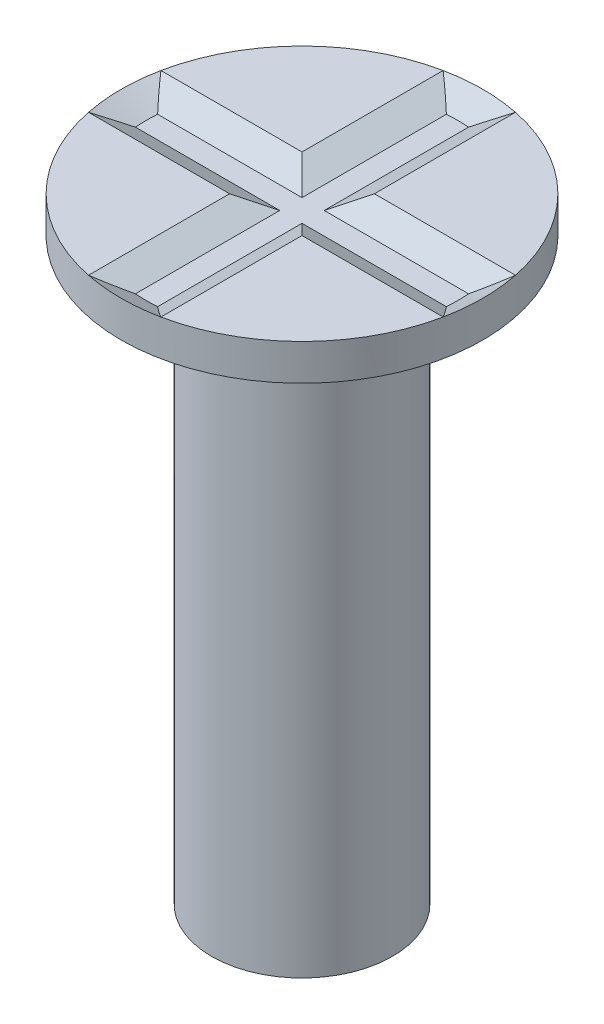
ISO-10303-21;
HEADER;
FILE_DESCRIPTION(('STEP AP214'),'2;1');
FILE_NAME('part.step','',(''),(''),'','','');
FILE_SCHEMA(('AUTOMOTIVE_DESIGN { 1 0 10303 214 1 1 1 1 }'));
ENDSEC;
DATA;
#1=APPLICATION_CONTEXT('core data for automotive mechanical design processes');
#2=APPLICATION_PROTOCOL_DEFINITION('international standard','automotive_design',2000,#1);
#3=PRODUCT_CONTEXT('',#1,'mechanical');
#4=PRODUCT('Part','Part','',(#3));
#5=PRODUCT_RELATED_PRODUCT_CATEGORY('part','',(#4));
#6=PRODUCT_DEFINITION_FORMATION('','',#4);
#7=PRODUCT_DEFINITION_CONTEXT('part definition',#1,'design');
#8=PRODUCT_DEFINITION('design','',#6,#7);
#9=PRODUCT_DEFINITION_SHAPE('','',#8);
#10=(LENGTH_UNIT() NAMED_UNIT(*) SI_UNIT(.MILLI.,.METRE.));
#11=(NAMED_UNIT(*) PLANE_ANGLE_UNIT() SI_UNIT($,.RADIAN.));
#12=(NAMED_UNIT(*) SI_UNIT($,.STERADIAN.) SOLID_ANGLE_UNIT());
#13=UNCERTAINTY_MEASURE_WITH_UNIT(LENGTH_MEASURE(1.E-05),#10,'distance_accuracy_value','');
#14=(GEOMETRIC_REPRESENTATION_CONTEXT(3) GLOBAL_UNCERTAINTY_ASSIGNED_CONTEXT((#13)) GLOBAL_UNIT_ASSIGNED_CONTEXT((#10,
#11,#12)) REPRESENTATION_CONTEXT('',''));
#15=CARTESIAN_POINT('',(0.,0.,0.));
#16=DIRECTION('',(0.,0.,1.));
#17=DIRECTION('',(1.,0.,0.));
#18=AXIS2_PLACEMENT_3D('',#15,#16,#17);
#19=CARTESIAN_POINT('',(0.,0.,0.));
#20=DIRECTION('',(0.,1.,0.));
#21=DIRECTION('',(0.,0.,1.));
#22=AXIS2_PLACEMENT_3D('',#19,#20,#21);
#23=PLANE('',#22);
#24=CARTESIAN_POINT('',(0.,0.,0.));
#25=DIRECTION('',(0.,1.,0.));
#26=DIRECTION('',(0.,0.,1.));
#27=AXIS2_PLACEMENT_3D('',#24,#25,#26);
#28=CIRCLE('',#27,0.5);
#29=CARTESIAN_POINT('',(-0.1,0.,-0.489897948556636));
#30=VERTEX_POINT('',#29);
#31=CARTESIAN_POINT('',(-0.489897948556636,0.,-0.1));
#32=VERTEX_POINT('',#31);
#33=EDGE_CURVE('E168',#30,#32,#28,.T.);
#34=ORIENTED_EDGE('',*,*,#33,.T.);
#35=DIRECTION('',(1.,0.,0.));
#36=VECTOR('',#35,1.);
#37=CARTESIAN_POINT('',(0.,0.,-0.1));
#38=LINE('',#37,#36);
#39=CARTESIAN_POINT('',(-0.1,0.,-0.1));
#40=VERTEX_POINT('',#39);
#41=EDGE_CURVE('E198',#32,#40,#38,.T.);
#42=ORIENTED_EDGE('',*,*,#41,.T.);
#43=DIRECTION('',(0.,0.,1.));
#44=VECTOR('',#43,1.);
#45=CARTESIAN_POINT('',(-0.1,0.,0.));
#46=LINE('',#45,#44);
#47=EDGE_CURVE('E195',#30,#40,#46,.T.);
#48=ORIENTED_EDGE('',*,*,#47,.F.);
#49=EDGE_LOOP('',(#34,#42,#48));
#50=FACE_BOUND('',#49,.T.);
#51=ADVANCED_FACE('F44',(#50),#23,.T.);
#52=CARTESIAN_POINT('',(0.0999999999999999,0.,0.489897948556636));
#53=VERTEX_POINT('',#52);
#54=CARTESIAN_POINT('',(0.489897948556636,0.,0.0999999999999999));
#55=VERTEX_POINT('',#54);
#56=EDGE_CURVE('E48',#53,#55,#28,.T.);
#57=ORIENTED_EDGE('',*,*,#56,.T.);
#58=DIRECTION('',(-1.,0.,0.));
#59=VECTOR('',#58,1.);
#60=CARTESIAN_POINT('',(0.,0.,0.0999999999999999));
#61=LINE('',#60,#59);
#62=CARTESIAN_POINT('',(0.0999999999999999,0.,0.0999999999999999));
#63=VERTEX_POINT('',#62);
#64=EDGE_CURVE('E513',#55,#63,#61,.T.);
#65=ORIENTED_EDGE('',*,*,#64,.T.);
#66=DIRECTION('',(0.,0.,-1.));
#67=VECTOR('',#66,1.);
#68=CARTESIAN_POINT('',(0.0999999999999999,0.,0.));
#69=LINE('',#68,#67);
#70=EDGE_CURVE('E165',#53,#63,#69,.T.);
#71=ORIENTED_EDGE('',*,*,#70,.F.);
#72=EDGE_LOOP('',(#57,#65,#71));
#73=FACE_BOUND('',#72,.T.);
#74=ADVANCED_FACE('F259',(#73),#23,.T.);
#75=DIRECTION('',(0.,0.,1.));
#76=VECTOR('',#75,1.);
#77=CARTESIAN_POINT('',(-0.1,0.,0.));
#78=LINE('',#77,#76);
#79=CARTESIAN_POINT('',(-0.1,0.,0.1));
#80=VERTEX_POINT('',#79);
#81=CARTESIAN_POINT('',(-0.1,0.,0.489897948556636));
#82=VERTEX_POINT('',#81);
#83=EDGE_CURVE('E153',#80,#82,#78,.T.);
#84=ORIENTED_EDGE('',*,*,#83,.F.);
#85=DIRECTION('',(-1.,0.,0.));
#86=VECTOR('',#85,1.);
#87=CARTESIAN_POINT('',(0.,0.,0.0999999999999999));
#88=LINE('',#87,#86);
#89=CARTESIAN_POINT('',(-0.489897948556636,0.,0.1));
#90=VERTEX_POINT('',#89);
#91=EDGE_CURVE('E59',#80,#90,#88,.T.);
#92=ORIENTED_EDGE('',*,*,#91,.T.);
#93=EDGE_CURVE('E162',#90,#82,#28,.T.);
#94=ORIENTED_EDGE('',*,*,#93,.T.);
#95=EDGE_LOOP('',(#84,#92,#94));
#96=FACE_BOUND('',#95,.T.);
#97=ADVANCED_FACE('F167',(#96),#23,.T.);
#98=CARTESIAN_POINT('',(0.,-0.1,0.));
#99=DIRECTION('',(0.,1.,0.));
#100=DIRECTION('',(0.,0.,1.));
#101=AXIS2_PLACEMENT_3D('',#98,#99,#100);
#102=CYLINDRICAL_SURFACE('',#101,0.5);
#103=CARTESIAN_POINT('',(0.,-0.1,0.));
#104=DIRECTION('',(0.,1.,0.));
#105=DIRECTION('',(0.,0.,1.));
#106=AXIS2_PLACEMENT_3D('',#103,#104,#105);
#107=CIRCLE('',#106,0.5);
#108=CARTESIAN_POINT('',(0.,-0.1,0.5));
#109=VERTEX_POINT('',#108);
#110=EDGE_CURVE('E13',#109,#109,#107,.T.);
#111=ORIENTED_EDGE('',*,*,#110,.T.);
#112=EDGE_LOOP('',(#111));
#113=FACE_BOUND('',#112,.T.);
#114=ORIENTED_EDGE('',*,*,#56,.F.);
#115=CARTESIAN_POINT('',(0.,0.,0.));
#116=DIRECTION('',(0.,1.,0.));
#117=DIRECTION('',(0.,0.,1.));
#118=AXIS2_PLACEMENT_3D('',#115,#116,#117);
#119=CIRCLE('',#118,0.5);
#120=EDGE_CURVE('E143',#82,#53,#119,.T.);
#121=ORIENTED_EDGE('',*,*,#120,.F.);
#122=ORIENTED_EDGE('',*,*,#93,.F.);
#123=CARTESIAN_POINT('',(0.,0.,0.));
#124=DIRECTION('',(0.,1.,0.));
#125=DIRECTION('',(0.,0.,1.));
#126=AXIS2_PLACEMENT_3D('',#123,#124,#125);
#127=CIRCLE('',#126,0.5);
#128=EDGE_CURVE('E205',#32,#90,#127,.T.);
#129=ORIENTED_EDGE('',*,*,#128,.F.);
#130=ORIENTED_EDGE('',*,*,#33,.F.);
#131=CARTESIAN_POINT('',(0.,0.,0.));
#132=DIRECTION('',(0.,1.,0.));
#133=DIRECTION('',(0.,0.,1.));
#134=AXIS2_PLACEMENT_3D('',#131,#132,#133);
#135=CIRCLE('',#134,0.5);
#136=CARTESIAN_POINT('',(0.0999999999999999,0.,-0.489897948556636));
#137=VERTEX_POINT('',#136);
#138=EDGE_CURVE('E192',#137,#30,#135,.T.);
#139=ORIENTED_EDGE('',*,*,#138,.F.);
#140=CARTESIAN_POINT('',(0.489897948556636,0.,-0.1));
#141=VERTEX_POINT('',#140);
#142=EDGE_CURVE('E171',#141,#137,#28,.T.);
#143=ORIENTED_EDGE('',*,*,#142,.F.);
#144=CARTESIAN_POINT('',(0.,0.,0.));
#145=DIRECTION('',(0.,1.,0.));
#146=DIRECTION('',(0.,0.,1.));
#147=AXIS2_PLACEMENT_3D('',#144,#145,#146);
#148=CIRCLE('',#147,0.5);
#149=EDGE_CURVE('E189',#55,#141,#148,.T.);
#150=ORIENTED_EDGE('',*,*,#149,.F.);
#151=EDGE_LOOP('',(#114,#121,#122,#129,#130,#139,#143,#150));
#152=FACE_BOUND('',#151,.T.);
#153=ADVANCED_FACE('F46',(#113,#152),#102,.T.);
#154=CARTESIAN_POINT('',(0.,-0.1,0.));
#155=DIRECTION('',(0.,1.,0.));
#156=DIRECTION('',(0.,0.,1.));
#157=AXIS2_PLACEMENT_3D('',#154,#155,#156);
#158=PLANE('',#157);
#159=CARTESIAN_POINT('',(0.,-0.1,0.));
#160=DIRECTION('',(0.,1.,0.));
#161=DIRECTION('',(0.,0.,1.));
#162=AXIS2_PLACEMENT_3D('',#159,#160,#161);
#163=CIRCLE('',#162,0.25);
#164=CARTESIAN_POINT('',(0.,-0.1,0.25));
#165=VERTEX_POINT('',#164);
#166=EDGE_CURVE('E173',#165,#165,#163,.T.);
#167=ORIENTED_EDGE('',*,*,#166,.T.);
#168=EDGE_LOOP('',(#167));
#169=FACE_BOUND('',#168,.T.);
#170=ORIENTED_EDGE('',*,*,#110,.F.);
#171=EDGE_LOOP('',(#170));
#172=FACE_BOUND('',#171,.T.);
#173=ADVANCED_FACE('F252',(#169,#172),#158,.F.);
#174=DIRECTION('',(0.,0.,-1.));
#175=VECTOR('',#174,1.);
#176=CARTESIAN_POINT('',(0.0999999999999999,0.,0.));
#177=LINE('',#176,#175);
#178=CARTESIAN_POINT('',(0.0999999999999999,0.,-0.1));
#179=VERTEX_POINT('',#178);
#180=EDGE_CURVE('E184',#179,#137,#177,.T.);
#181=ORIENTED_EDGE('',*,*,#180,.F.);
#182=DIRECTION('',(1.,0.,0.));
#183=VECTOR('',#182,1.);
#184=CARTESIAN_POINT('',(0.,0.,-0.1));
#185=LINE('',#184,#183);
#186=EDGE_CURVE('E186',#179,#141,#185,.T.);
#187=ORIENTED_EDGE('',*,*,#186,.T.);
#188=ORIENTED_EDGE('',*,*,#142,.T.);
#189=EDGE_LOOP('',(#181,#187,#188));
#190=FACE_BOUND('',#189,.T.);
#191=ADVANCED_FACE('F182',(#190),#23,.T.);
#192=CARTESIAN_POINT('',(0.,-1.7,0.));
#193=DIRECTION('',(0.,1.,0.));
#194=DIRECTION('',(0.,0.,1.));
#195=AXIS2_PLACEMENT_3D('',#192,#193,#194);
#196=CYLINDRICAL_SURFACE('',#195,0.25);
#197=CARTESIAN_POINT('',(0.,-1.7,0.));
#198=DIRECTION('',(0.,1.,0.));
#199=DIRECTION('',(0.,0.,1.));
#200=AXIS2_PLACEMENT_3D('',#197,#198,#199);
#201=CIRCLE('',#200,0.25);
#202=CARTESIAN_POINT('',(0.,-1.7,0.25));
#203=VERTEX_POINT('',#202);
#204=EDGE_CURVE('E169',#203,#203,#201,.T.);
#205=ORIENTED_EDGE('',*,*,#204,.T.);
#206=EDGE_LOOP('',(#205));
#207=FACE_BOUND('',#206,.T.);
#208=ORIENTED_EDGE('',*,*,#166,.F.);
#209=EDGE_LOOP('',(#208));
#210=FACE_BOUND('',#209,.T.);
#211=ADVANCED_FACE('F247',(#207,#210),#196,.T.);
#212=CARTESIAN_POINT('',(0.,-1.7,0.));
#213=DIRECTION('',(0.,1.,0.));
#214=DIRECTION('',(0.,0.,1.));
#215=AXIS2_PLACEMENT_3D('',#212,#213,#214);
#216=PLANE('',#215);
#217=ORIENTED_EDGE('',*,*,#204,.F.);
#218=EDGE_LOOP('',(#217));
#219=FACE_BOUND('',#218,.T.);
#220=ADVANCED_FACE('F244',(#219),#216,.F.);
#221=CARTESIAN_POINT('',(0.,0.,0.0999999999999999));
#222=DIRECTION('',(0.,-0.86602540378444,0.499999999999998));
#223=DIRECTION('',(0.,-0.499999999999998,-0.86602540378444));
#224=AXIS2_PLACEMENT_3D('',#221,#222,#223);
#225=PLANE('',#224);
#226=ORIENTED_EDGE('',*,*,#91,.F.);
#227=DIRECTION('',(0.654653670707978,-0.377964473009226,-0.654653670707978));
#228=VECTOR('',#227,1.);
#229=CARTESIAN_POINT('',(-0.0571428571428571,-0.0247435829652696,0.057142857142857));
#230=LINE('',#229,#228);
#231=CARTESIAN_POINT('',(-0.0307179676972445,-0.04,0.0307179676972445));
#232=VERTEX_POINT('',#231);
#233=EDGE_CURVE('E100',#232,#80,#230,.F.);
#234=ORIENTED_EDGE('',*,*,#233,.F.);
#235=DIRECTION('',(1.,0.,0.));
#236=VECTOR('',#235,1.);
#237=CARTESIAN_POINT('',(0.,-0.04,0.0307179676972445));
#238=LINE('',#237,#236);
#239=CARTESIAN_POINT('',(-0.429621198450211,-0.04,0.0307179676972445));
#240=VERTEX_POINT('',#239);
#241=EDGE_CURVE('E65',#232,#240,#238,.F.);
#242=ORIENTED_EDGE('',*,*,#241,.T.);
#243=CARTESIAN_POINT('',(-0.429621198450211,-0.04,0.0307179676972445));
#244=CARTESIAN_POINT('',(-0.440087405999665,-0.0334913974772498,0.041991197952919));
#245=CARTESIAN_POINT('',(-0.450343661313279,-0.0269036997620823,0.0534014251004944));
#246=CARTESIAN_POINT('',(-0.470435895816985,-0.0135703605775229,0.0764954460027004));
#247=CARTESIAN_POINT('',(-0.480271890540691,-0.00682472496010054,0.0881792296214223));
#248=CARTESIAN_POINT('',(-0.489897948562168,-2.23057487750539E-12,0.0999999999961365));
#249=B_SPLINE_CURVE_WITH_KNOTS('',3,(#243,#244,#245,#246,#247,#248),.UNSPECIFIED.,.F.,.F.,(4,2,
4),(0.,0.0500902820937704,0.100178711153107),.UNSPECIFIED.);
#250=EDGE_CURVE('E102',#240,#90,#249,.T.);
#251=ORIENTED_EDGE('',*,*,#250,.T.);
#252=EDGE_LOOP('',(#226,#234,#242,#251));
#253=FACE_BOUND('',#252,.T.);
#254=ADVANCED_FACE('F214',(#253),#225,.F.);
#255=CARTESIAN_POINT('',(0.,0.,0.));
#256=DIRECTION('',(0.,1.,0.));
#257=DIRECTION('',(0.,0.,1.));
#258=AXIS2_PLACEMENT_3D('',#255,#256,#257);
#259=CONICAL_SURFACE('',#258,0.5,1.0471975511966);
#260=ORIENTED_EDGE('',*,*,#128,.T.);
#261=ORIENTED_EDGE('',*,*,#250,.F.);
#262=CARTESIAN_POINT('',(0.,-0.04,0.));
#263=DIRECTION('',(0.,1.,0.));
#264=DIRECTION('',(0.,0.,1.));
#265=AXIS2_PLACEMENT_3D('',#262,#263,#264);
#266=CIRCLE('',#265,0.430717967697245);
#267=CARTESIAN_POINT('',(-0.429621198450211,-0.04,-0.0307179676972445));
#268=VERTEX_POINT('',#267);
#269=EDGE_CURVE('E427',#268,#240,#266,.T.);
#270=ORIENTED_EDGE('',*,*,#269,.F.);
#271=CARTESIAN_POINT('',(-0.429621198450211,-0.04,-0.0307179676972445));
#272=CARTESIAN_POINT('',(-0.440087405999665,-0.0334913974772498,-0.041991197952919));
#273=CARTESIAN_POINT('',(-0.450343661313279,-0.0269036997620823,-0.0534014251004945));
#274=CARTESIAN_POINT('',(-0.470435895816985,-0.0135703605775229,-0.0764954460027005));
#275=CARTESIAN_POINT('',(-0.480271890540691,-0.00682472496010054,-0.0881792296214223));
#276=CARTESIAN_POINT('',(-0.489897948562168,-2.23057304757508E-12,-0.0999999999961365));
#277=B_SPLINE_CURVE_WITH_KNOTS('',3,(#271,#272,#273,#274,#275,#276),.UNSPECIFIED.,.F.,.F.,(4,2,
4),(0.,0.0500902820937704,0.100178711153107),.UNSPECIFIED.);
#278=EDGE_CURVE('E108',#268,#32,#277,.T.);
#279=ORIENTED_EDGE('',*,*,#278,.T.);
#280=EDGE_LOOP('',(#260,#261,#270,#279));
#281=FACE_BOUND('',#280,.T.);
#282=ADVANCED_FACE('F217',(#281),#259,.F.);
#283=CARTESIAN_POINT('',(0.,0.,-0.1));
#284=DIRECTION('',(0.,-0.86602540378444,-0.499999999999998));
#285=DIRECTION('',(0.,0.499999999999998,-0.86602540378444));
#286=AXIS2_PLACEMENT_3D('',#283,#284,#285);
#287=PLANE('',#286);
#288=ORIENTED_EDGE('',*,*,#41,.F.);
#289=ORIENTED_EDGE('',*,*,#278,.F.);
#290=DIRECTION('',(-1.,0.,0.));
#291=VECTOR('',#290,1.);
#292=CARTESIAN_POINT('',(0.,-0.04,-0.0307179676972445));
#293=LINE('',#292,#291);
#294=CARTESIAN_POINT('',(-0.0307179676972446,-0.04,-0.0307179676972445));
#295=VERTEX_POINT('',#294);
#296=EDGE_CURVE('E456',#268,#295,#293,.F.);
#297=ORIENTED_EDGE('',*,*,#296,.T.);
#298=DIRECTION('',(0.654653670707978,-0.377964473009225,0.654653670707978));
#299=VECTOR('',#298,1.);
#300=CARTESIAN_POINT('',(-0.0571428571428571,-0.0247435829652696,-0.0571428571428571));
#301=LINE('',#300,#299);
#302=EDGE_CURVE('E233',#295,#40,#301,.F.);
#303=ORIENTED_EDGE('',*,*,#302,.T.);
#304=EDGE_LOOP('',(#288,#289,#297,#303));
#305=FACE_BOUND('',#304,.T.);
#306=ADVANCED_FACE('F221',(#305),#287,.F.);
#307=CARTESIAN_POINT('',(-0.1,0.,0.));
#308=DIRECTION('',(-0.499999999999998,-0.86602540378444,0.));
#309=DIRECTION('',(0.86602540378444,-0.499999999999998,0.));
#310=AXIS2_PLACEMENT_3D('',#307,#308,#309);
#311=PLANE('',#310);
#312=ORIENTED_EDGE('',*,*,#47,.T.);
#313=ORIENTED_EDGE('',*,*,#302,.F.);
#314=DIRECTION('',(0.,0.,1.));
#315=VECTOR('',#314,1.);
#316=CARTESIAN_POINT('',(-0.0307179676972445,-0.04,0.));
#317=LINE('',#316,#315);
#318=CARTESIAN_POINT('',(-0.0307179676972446,-0.04,-0.429621198450211));
#319=VERTEX_POINT('',#318);
#320=EDGE_CURVE('E453',#319,#295,#317,.T.);
#321=ORIENTED_EDGE('',*,*,#320,.F.);
#322=CARTESIAN_POINT('',(-0.0307179676972446,-0.04,-0.429621198450211));
#323=CARTESIAN_POINT('',(-0.041991197952919,-0.0334913974772498,-0.440087405999665));
#324=CARTESIAN_POINT('',(-0.0534014251004945,-0.0269036997620823,-0.450343661313279));
#325=CARTESIAN_POINT('',(-0.0764954460027005,-0.0135703605775229,-0.470435895816985));
#326=CARTESIAN_POINT('',(-0.0881792296214224,-0.00682472496010054,-0.480271890540691));
#327=CARTESIAN_POINT('',(-0.0999999999961366,-2.23055753669782E-12,-0.489897948562168));
#328=B_SPLINE_CURVE_WITH_KNOTS('',3,(#322,#323,#324,#325,#326,#327),.UNSPECIFIED.,.F.,.F.,(4,2,
4),(0.,0.0500902820937704,0.100178711153107),.UNSPECIFIED.);
#329=EDGE_CURVE('E459',#319,#30,#328,.T.);
#330=ORIENTED_EDGE('',*,*,#329,.T.);
#331=EDGE_LOOP('',(#312,#313,#321,#330));
#332=FACE_BOUND('',#331,.T.);
#333=ADVANCED_FACE('F240',(#332),#311,.F.);
#334=CARTESIAN_POINT('',(0.,0.,0.));
#335=DIRECTION('',(0.,1.,0.));
#336=DIRECTION('',(0.,0.,1.));
#337=AXIS2_PLACEMENT_3D('',#334,#335,#336);
#338=CONICAL_SURFACE('',#337,0.5,1.0471975511966);
#339=ORIENTED_EDGE('',*,*,#138,.T.);
#340=ORIENTED_EDGE('',*,*,#329,.F.);
#341=CARTESIAN_POINT('',(0.,-0.04,0.));
#342=DIRECTION('',(0.,1.,0.));
#343=DIRECTION('',(0.,0.,1.));
#344=AXIS2_PLACEMENT_3D('',#341,#342,#343);
#345=CIRCLE('',#344,0.430717967697245);
#346=CARTESIAN_POINT('',(0.0307179676972445,-0.04,-0.429621198450211));
#347=VERTEX_POINT('',#346);
#348=EDGE_CURVE('E450',#347,#319,#345,.T.);
#349=ORIENTED_EDGE('',*,*,#348,.F.);
#350=CARTESIAN_POINT('',(0.0307179676972445,-0.04,-0.429621198450211));
#351=CARTESIAN_POINT('',(0.0419911979529189,-0.0334913974772498,-0.440087405999665));
#352=CARTESIAN_POINT('',(0.0534014251004944,-0.0269036997620823,-0.450343661313279));
#353=CARTESIAN_POINT('',(0.0764954460027004,-0.0135703605775229,-0.470435895816985));
#354=CARTESIAN_POINT('',(0.0881792296214223,-0.00682472496010054,-0.480271890540691));
#355=CARTESIAN_POINT('',(0.0999999999961365,-2.23057409685368E-12,-0.489897948562168));
#356=B_SPLINE_CURVE_WITH_KNOTS('',3,(#350,#351,#352,#353,#354,#355),.UNSPECIFIED.,.F.,.F.,(4,2,
4),(0.,0.0500902820937704,0.100178711153107),.UNSPECIFIED.);
#357=EDGE_CURVE('E463',#347,#137,#356,.T.);
#358=ORIENTED_EDGE('',*,*,#357,.T.);
#359=EDGE_LOOP('',(#339,#340,#349,#358));
#360=FACE_BOUND('',#359,.T.);
#361=ADVANCED_FACE('F331',(#360),#338,.F.);
#362=CARTESIAN_POINT('',(0.0999999999999999,0.,0.));
#363=DIRECTION('',(0.499999999999998,-0.86602540378444,0.));
#364=DIRECTION('',(0.86602540378444,0.499999999999998,0.));
#365=AXIS2_PLACEMENT_3D('',#362,#363,#364);
#366=PLANE('',#365);
#367=ORIENTED_EDGE('',*,*,#180,.T.);
#368=ORIENTED_EDGE('',*,*,#357,.F.);
#369=DIRECTION('',(0.,0.,-1.));
#370=VECTOR('',#369,1.);
#371=CARTESIAN_POINT('',(0.0307179676972445,-0.04,0.));
#372=LINE('',#371,#370);
#373=CARTESIAN_POINT('',(0.0307179676972445,-0.04,-0.0307179676972445));
#374=VERTEX_POINT('',#373);
#375=EDGE_CURVE('E447',#374,#347,#372,.T.);
#376=ORIENTED_EDGE('',*,*,#375,.F.);
#377=DIRECTION('',(-0.654653670707978,-0.377964473009225,0.654653670707978));
#378=VECTOR('',#377,1.);
#379=CARTESIAN_POINT('',(0.057142857142857,-0.0247435829652696,-0.0571428571428571));
#380=LINE('',#379,#378);
#381=EDGE_CURVE('E464',#374,#179,#380,.F.);
#382=ORIENTED_EDGE('',*,*,#381,.T.);
#383=EDGE_LOOP('',(#367,#368,#376,#382));
#384=FACE_BOUND('',#383,.T.);
#385=ADVANCED_FACE('F340',(#384),#366,.F.);
#386=CARTESIAN_POINT('',(0.,0.,-0.1));
#387=DIRECTION('',(0.,-0.86602540378444,-0.499999999999998));
#388=DIRECTION('',(0.,0.499999999999998,-0.86602540378444));
#389=AXIS2_PLACEMENT_3D('',#386,#387,#388);
#390=PLANE('',#389);
#391=ORIENTED_EDGE('',*,*,#186,.F.);
#392=ORIENTED_EDGE('',*,*,#381,.F.);
#393=DIRECTION('',(-1.,0.,0.));
#394=VECTOR('',#393,1.);
#395=CARTESIAN_POINT('',(0.,-0.04,-0.0307179676972445));
#396=LINE('',#395,#394);
#397=CARTESIAN_POINT('',(0.429621198450211,-0.04,-0.0307179676972445));
#398=VERTEX_POINT('',#397);
#399=EDGE_CURVE('E445',#374,#398,#396,.F.);
#400=ORIENTED_EDGE('',*,*,#399,.T.);
#401=CARTESIAN_POINT('',(0.429621198450211,-0.04,-0.0307179676972445));
#402=CARTESIAN_POINT('',(0.440087405999665,-0.0334913974772498,-0.041991197952919));
#403=CARTESIAN_POINT('',(0.450343661313279,-0.0269036997620823,-0.0534014251004945));
#404=CARTESIAN_POINT('',(0.470435895816985,-0.0135703605775229,-0.0764954460027005));
#405=CARTESIAN_POINT('',(0.480271890540691,-0.00682472496010054,-0.0881792296214223));
#406=CARTESIAN_POINT('',(0.489897948562168,-2.23057304757508E-12,-0.0999999999961365));
#407=B_SPLINE_CURVE_WITH_KNOTS('',3,(#401,#402,#403,#404,#405,#406),.UNSPECIFIED.,.F.,.F.,(4,2,
4),(0.,0.0500902820937704,0.100178711153107),.UNSPECIFIED.);
#408=EDGE_CURVE('E481',#398,#141,#407,.T.);
#409=ORIENTED_EDGE('',*,*,#408,.T.);
#410=EDGE_LOOP('',(#391,#392,#400,#409));
#411=FACE_BOUND('',#410,.T.);
#412=ADVANCED_FACE('F348',(#411),#390,.F.);
#413=CARTESIAN_POINT('',(0.,0.,0.));
#414=DIRECTION('',(0.,1.,0.));
#415=DIRECTION('',(0.,0.,1.));
#416=AXIS2_PLACEMENT_3D('',#413,#414,#415);
#417=CONICAL_SURFACE('',#416,0.5,1.0471975511966);
#418=ORIENTED_EDGE('',*,*,#149,.T.);
#419=ORIENTED_EDGE('',*,*,#408,.F.);
#420=CARTESIAN_POINT('',(0.,-0.04,0.));
#421=DIRECTION('',(0.,1.,0.));
#422=DIRECTION('',(0.,0.,1.));
#423=AXIS2_PLACEMENT_3D('',#420,#421,#422);
#424=CIRCLE('',#423,0.430717967697245);
#425=CARTESIAN_POINT('',(0.429621198450211,-0.04,0.0307179676972444));
#426=VERTEX_POINT('',#425);
#427=EDGE_CURVE('E442',#426,#398,#424,.T.);
#428=ORIENTED_EDGE('',*,*,#427,.F.);
#429=CARTESIAN_POINT('',(0.429621198450211,-0.04,0.0307179676972444));
#430=CARTESIAN_POINT('',(0.440087405999665,-0.0334913974772498,0.0419911979529189));
#431=CARTESIAN_POINT('',(0.450343661313279,-0.0269036997620823,0.0534014251004943));
#432=CARTESIAN_POINT('',(0.470435895816985,-0.0135703605775229,0.0764954460027003));
#433=CARTESIAN_POINT('',(0.480271890540691,-0.00682472496010054,0.0881792296214222));
#434=CARTESIAN_POINT('',(0.489897948562168,-2.23057508740247E-12,0.0999999999961364));
#435=B_SPLINE_CURVE_WITH_KNOTS('',3,(#429,#430,#431,#432,#433,#434),.UNSPECIFIED.,.F.,.F.,(4,2,
4),(0.,0.0500902820937704,0.100178711153107),.UNSPECIFIED.);
#436=EDGE_CURVE('E487',#426,#55,#435,.T.);
#437=ORIENTED_EDGE('',*,*,#436,.T.);
#438=EDGE_LOOP('',(#418,#419,#428,#437));
#439=FACE_BOUND('',#438,.T.);
#440=ADVANCED_FACE('F358',(#439),#417,.F.);
#441=CARTESIAN_POINT('',(0.,0.,0.0999999999999999));
#442=DIRECTION('',(0.,-0.86602540378444,0.499999999999998));
#443=DIRECTION('',(0.,-0.499999999999998,-0.86602540378444));
#444=AXIS2_PLACEMENT_3D('',#441,#442,#443);
#445=PLANE('',#444);
#446=ORIENTED_EDGE('',*,*,#64,.F.);
#447=ORIENTED_EDGE('',*,*,#436,.F.);
#448=DIRECTION('',(1.,0.,0.));
#449=VECTOR('',#448,1.);
#450=CARTESIAN_POINT('',(0.,-0.04,0.0307179676972445));
#451=LINE('',#450,#449);
#452=CARTESIAN_POINT('',(0.0307179676972445,-0.04,0.0307179676972445));
#453=VERTEX_POINT('',#452);
#454=EDGE_CURVE('E440',#426,#453,#451,.F.);
#455=ORIENTED_EDGE('',*,*,#454,.T.);
#456=DIRECTION('',(-0.654653670707978,-0.377964473009226,-0.654653670707978));
#457=VECTOR('',#456,1.);
#458=CARTESIAN_POINT('',(0.057142857142857,-0.0247435829652696,0.057142857142857));
#459=LINE('',#458,#457);
#460=EDGE_CURVE('E502',#453,#63,#459,.F.);
#461=ORIENTED_EDGE('',*,*,#460,.T.);
#462=EDGE_LOOP('',(#446,#447,#455,#461));
#463=FACE_BOUND('',#462,.T.);
#464=ADVANCED_FACE('F368',(#463),#445,.F.);
#465=CARTESIAN_POINT('',(0.0999999999999999,0.,0.));
#466=DIRECTION('',(0.499999999999998,-0.86602540378444,0.));
#467=DIRECTION('',(0.86602540378444,0.499999999999998,0.));
#468=AXIS2_PLACEMENT_3D('',#465,#466,#467);
#469=PLANE('',#468);
#470=ORIENTED_EDGE('',*,*,#70,.T.);
#471=ORIENTED_EDGE('',*,*,#460,.F.);
#472=DIRECTION('',(0.,0.,-1.));
#473=VECTOR('',#472,1.);
#474=CARTESIAN_POINT('',(0.0307179676972445,-0.04,0.));
#475=LINE('',#474,#473);
#476=CARTESIAN_POINT('',(0.0307179676972445,-0.04,0.429621198450211));
#477=VERTEX_POINT('',#476);
#478=EDGE_CURVE('E429',#477,#453,#475,.T.);
#479=ORIENTED_EDGE('',*,*,#478,.F.);
#480=CARTESIAN_POINT('',(0.0307179676972445,-0.04,0.429621198450211));
#481=CARTESIAN_POINT('',(0.0419911979529189,-0.0334913974772498,0.440087405999665));
#482=CARTESIAN_POINT('',(0.0534014251004944,-0.0269036997620823,0.450343661313279));
#483=CARTESIAN_POINT('',(0.0764954460027004,-0.0135703605775229,0.470435895816985));
#484=CARTESIAN_POINT('',(0.0881792296214222,-0.00682472496010054,0.480271890540691));
#485=CARTESIAN_POINT('',(0.0999999999961365,-2.23057125590187E-12,0.489897948562168));
#486=B_SPLINE_CURVE_WITH_KNOTS('',3,(#480,#481,#482,#483,#484,#485),.UNSPECIFIED.,.F.,.F.,(4,2,
4),(0.,0.0500902820937704,0.100178711153107),.UNSPECIFIED.);
#487=EDGE_CURVE('E150',#477,#53,#486,.T.);
#488=ORIENTED_EDGE('',*,*,#487,.T.);
#489=EDGE_LOOP('',(#470,#471,#479,#488));
#490=FACE_BOUND('',#489,.T.);
#491=ADVANCED_FACE('F378',(#490),#469,.F.);
#492=CARTESIAN_POINT('',(0.,0.,0.));
#493=DIRECTION('',(0.,1.,0.));
#494=DIRECTION('',(0.,0.,1.));
#495=AXIS2_PLACEMENT_3D('',#492,#493,#494);
#496=CONICAL_SURFACE('',#495,0.5,1.0471975511966);
#497=ORIENTED_EDGE('',*,*,#120,.T.);
#498=ORIENTED_EDGE('',*,*,#487,.F.);
#499=CARTESIAN_POINT('',(0.,-0.04,0.));
#500=DIRECTION('',(0.,1.,0.));
#501=DIRECTION('',(0.,0.,1.));
#502=AXIS2_PLACEMENT_3D('',#499,#500,#501);
#503=CIRCLE('',#502,0.430717967697245);
#504=CARTESIAN_POINT('',(-0.0307179676972445,-0.04,0.429621198450211));
#505=VERTEX_POINT('',#504);
#506=EDGE_CURVE('E146',#505,#477,#503,.T.);
#507=ORIENTED_EDGE('',*,*,#506,.F.);
#508=CARTESIAN_POINT('',(-0.0307179676972445,-0.04,0.429621198450211));
#509=CARTESIAN_POINT('',(-0.0419911979529189,-0.0334913974772498,0.440087405999665));
#510=CARTESIAN_POINT('',(-0.0534014251004944,-0.0269036997620823,0.450343661313279));
#511=CARTESIAN_POINT('',(-0.0764954460027004,-0.0135703605775229,0.470435895816985));
#512=CARTESIAN_POINT('',(-0.0881792296214223,-0.00682472496010054,0.480271890540691));
#513=CARTESIAN_POINT('',(-0.0999999999961365,-2.23057489074028E-12,0.489897948562168));
#514=B_SPLINE_CURVE_WITH_KNOTS('',3,(#508,#509,#510,#511,#512,#513),.UNSPECIFIED.,.F.,.F.,(4,2,
4),(0.,0.0500902820937704,0.100178711153107),.UNSPECIFIED.);
#515=EDGE_CURVE('E139',#505,#82,#514,.T.);
#516=ORIENTED_EDGE('',*,*,#515,.T.);
#517=EDGE_LOOP('',(#497,#498,#507,#516));
#518=FACE_BOUND('',#517,.T.);
#519=ADVANCED_FACE('F141',(#518),#496,.F.);
#520=CARTESIAN_POINT('',(-0.1,0.,0.));
#521=DIRECTION('',(-0.499999999999998,-0.86602540378444,0.));
#522=DIRECTION('',(0.86602540378444,-0.499999999999998,0.));
#523=AXIS2_PLACEMENT_3D('',#520,#521,#522);
#524=PLANE('',#523);
#525=ORIENTED_EDGE('',*,*,#83,.T.);
#526=ORIENTED_EDGE('',*,*,#515,.F.);
#527=DIRECTION('',(0.,0.,1.));
#528=VECTOR('',#527,1.);
#529=CARTESIAN_POINT('',(-0.0307179676972445,-0.04,0.));
#530=LINE('',#529,#528);
#531=EDGE_CURVE('E425',#232,#505,#530,.T.);
#532=ORIENTED_EDGE('',*,*,#531,.F.);
#533=ORIENTED_EDGE('',*,*,#233,.T.);
#534=EDGE_LOOP('',(#525,#526,#532,#533));
#535=FACE_BOUND('',#534,.T.);
#536=ADVANCED_FACE('F154',(#535),#524,.F.);
#537=CARTESIAN_POINT('',(0.,-0.04,0.));
#538=DIRECTION('',(0.,1.,0.));
#539=DIRECTION('',(0.,0.,1.));
#540=AXIS2_PLACEMENT_3D('',#537,#538,#539);
#541=PLANE('',#540);
#542=ORIENTED_EDGE('',*,*,#241,.F.);
#543=ORIENTED_EDGE('',*,*,#531,.T.);
#544=ORIENTED_EDGE('',*,*,#506,.T.);
#545=ORIENTED_EDGE('',*,*,#478,.T.);
#546=ORIENTED_EDGE('',*,*,#454,.F.);
#547=ORIENTED_EDGE('',*,*,#427,.T.);
#548=ORIENTED_EDGE('',*,*,#399,.F.);
#549=ORIENTED_EDGE('',*,*,#375,.T.);
#550=ORIENTED_EDGE('',*,*,#348,.T.);
#551=ORIENTED_EDGE('',*,*,#320,.T.);
#552=ORIENTED_EDGE('',*,*,#296,.F.);
#553=ORIENTED_EDGE('',*,*,#269,.T.);
#554=EDGE_LOOP('',(#542,#543,#544,#545,#546,#547,#548,#549,#550,#551,#552,#553));
#555=FACE_BOUND('',#554,.T.);
#556=ADVANCED_FACE('F404',(#555),#541,.T.);
#557=CLOSED_SHELL('',(#51,#74,#97,#153,#173,#191,#211,#220,#254,#282,#306,#333,#361,#385,#412,
#440,#464,#491,#519,#536,#556));
#558=MANIFOLD_SOLID_BREP('B2',#557);
#559=ADVANCED_BREP_SHAPE_REPRESENTATION('',(#18,#558),#14);
#560=SHAPE_DEFINITION_REPRESENTATION(#9,#559);
ENDSEC;
END-ISO-10303-21;
